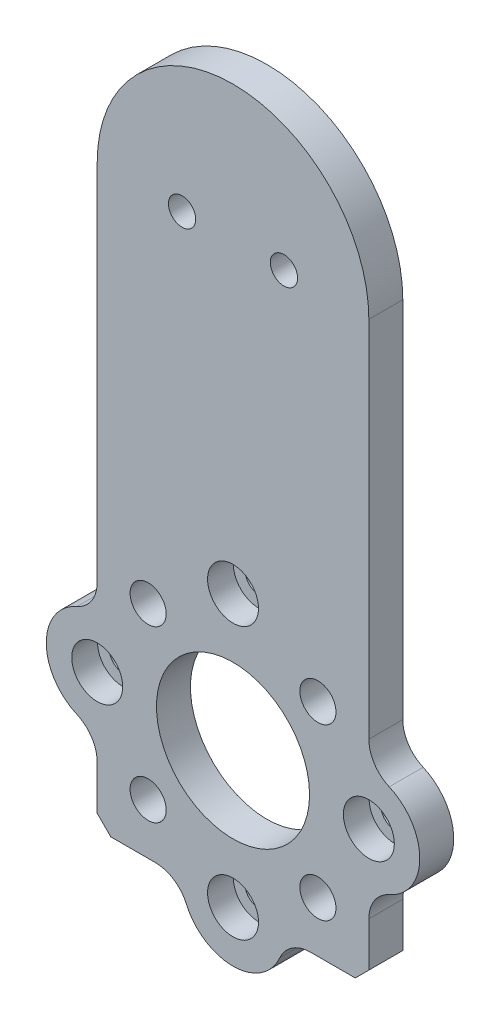
ISO-10303-21;
HEADER;
FILE_DESCRIPTION(('STEP AP214'),'2;1');
FILE_NAME('part.step','',(''),(''),'','','');
FILE_SCHEMA(('AUTOMOTIVE_DESIGN { 1 0 10303 214 1 1 1 1 }'));
ENDSEC;
DATA;
#1=APPLICATION_CONTEXT('core data for automotive mechanical design processes');
#2=APPLICATION_PROTOCOL_DEFINITION('international standard','automotive_design',2000,#1);
#3=PRODUCT_CONTEXT('',#1,'mechanical');
#4=PRODUCT('Part','Part','',(#3));
#5=PRODUCT_RELATED_PRODUCT_CATEGORY('part','',(#4));
#6=PRODUCT_DEFINITION_FORMATION('','',#4);
#7=PRODUCT_DEFINITION_CONTEXT('part definition',#1,'design');
#8=PRODUCT_DEFINITION('design','',#6,#7);
#9=PRODUCT_DEFINITION_SHAPE('','',#8);
#10=(LENGTH_UNIT() NAMED_UNIT(*) SI_UNIT(.MILLI.,.METRE.));
#11=(NAMED_UNIT(*) PLANE_ANGLE_UNIT() SI_UNIT($,.RADIAN.));
#12=(NAMED_UNIT(*) SI_UNIT($,.STERADIAN.) SOLID_ANGLE_UNIT());
#13=UNCERTAINTY_MEASURE_WITH_UNIT(LENGTH_MEASURE(1.E-05),#10,'distance_accuracy_value','');
#14=(GEOMETRIC_REPRESENTATION_CONTEXT(3) GLOBAL_UNCERTAINTY_ASSIGNED_CONTEXT((#13)) GLOBAL_UNIT_ASSIGNED_CONTEXT((#10,
#11,#12)) REPRESENTATION_CONTEXT('',''));
#15=CARTESIAN_POINT('',(0.,0.,0.));
#16=DIRECTION('',(0.,0.,1.));
#17=DIRECTION('',(1.,0.,0.));
#18=AXIS2_PLACEMENT_3D('',#15,#16,#17);
#19=CARTESIAN_POINT('',(0.,25.4,6.35));
#20=DIRECTION('',(0.,0.,-1.));
#21=DIRECTION('',(-1.,0.,0.));
#22=AXIS2_PLACEMENT_3D('',#19,#20,#21);
#23=PLANE('',#22);
#24=CARTESIAN_POINT('',(15.8749999999999,107.95,6.35));
#25=DIRECTION('',(0.,0.,-1.));
#26=DIRECTION('',(-1.,0.,0.));
#27=AXIS2_PLACEMENT_3D('',#24,#25,#26);
#28=CIRCLE('',#27,2.5527);
#29=CARTESIAN_POINT('',(13.3222999999999,107.95,6.35));
#30=VERTEX_POINT('',#29);
#31=EDGE_CURVE('E459',#30,#30,#28,.T.);
#32=ORIENTED_EDGE('',*,*,#31,.T.);
#33=EDGE_LOOP('',(#32));
#34=FACE_BOUND('',#33,.T.);
#35=CARTESIAN_POINT('',(34.9249999999999,107.95,6.35));
#36=DIRECTION('',(0.,0.,-1.));
#37=DIRECTION('',(-1.,0.,0.));
#38=AXIS2_PLACEMENT_3D('',#35,#36,#37);
#39=CIRCLE('',#38,2.5527);
#40=CARTESIAN_POINT('',(32.3722999999999,107.95,6.35));
#41=VERTEX_POINT('',#40);
#42=EDGE_CURVE('E451',#41,#41,#39,.T.);
#43=ORIENTED_EDGE('',*,*,#42,.T.);
#44=EDGE_LOOP('',(#43));
#45=FACE_BOUND('',#44,.T.);
#46=CARTESIAN_POINT('',(0.,25.4,6.35));
#47=DIRECTION('',(0.,0.,1.));
#48=DIRECTION('',(1.,0.,0.));
#49=AXIS2_PLACEMENT_3D('',#46,#47,#48);
#50=CIRCLE('',#49,4.7625);
#51=CARTESIAN_POINT('',(4.7625,25.4,6.35));
#52=VERTEX_POINT('',#51);
#53=EDGE_CURVE('E448',#52,#52,#50,.T.);
#54=ORIENTED_EDGE('',*,*,#53,.F.);
#55=EDGE_LOOP('',(#54));
#56=FACE_BOUND('',#55,.T.);
#57=CARTESIAN_POINT('',(50.8,25.4,6.35));
#58=DIRECTION('',(0.,0.,1.));
#59=DIRECTION('',(1.,0.,0.));
#60=AXIS2_PLACEMENT_3D('',#57,#58,#59);
#61=CIRCLE('',#60,4.7625);
#62=CARTESIAN_POINT('',(55.5625,25.4,6.35));
#63=VERTEX_POINT('',#62);
#64=EDGE_CURVE('E436',#63,#63,#61,.T.);
#65=ORIENTED_EDGE('',*,*,#64,.F.);
#66=EDGE_LOOP('',(#65));
#67=FACE_BOUND('',#66,.T.);
#68=CARTESIAN_POINT('',(25.4,0.,6.35));
#69=DIRECTION('',(0.,0.,1.));
#70=DIRECTION('',(1.,0.,0.));
#71=AXIS2_PLACEMENT_3D('',#68,#69,#70);
#72=CIRCLE('',#71,4.7625);
#73=CARTESIAN_POINT('',(30.1625,0.,6.35));
#74=VERTEX_POINT('',#73);
#75=EDGE_CURVE('E423',#74,#74,#72,.T.);
#76=ORIENTED_EDGE('',*,*,#75,.F.);
#77=EDGE_LOOP('',(#76));
#78=FACE_BOUND('',#77,.T.);
#79=CARTESIAN_POINT('',(25.4,50.8,6.35));
#80=DIRECTION('',(0.,0.,1.));
#81=DIRECTION('',(1.,0.,0.));
#82=AXIS2_PLACEMENT_3D('',#79,#80,#81);
#83=CIRCLE('',#82,4.7625);
#84=CARTESIAN_POINT('',(30.1625,50.8,6.35));
#85=VERTEX_POINT('',#84);
#86=EDGE_CURVE('E410',#85,#85,#83,.T.);
#87=ORIENTED_EDGE('',*,*,#86,.F.);
#88=EDGE_LOOP('',(#87));
#89=FACE_BOUND('',#88,.T.);
#90=DIRECTION('',(0.,-1.,0.));
#91=VECTOR('',#90,1.);
#92=CARTESIAN_POINT('',(0.,0.,6.35));
#93=LINE('',#92,#91);
#94=CARTESIAN_POINT('',(0.,10.8503221685152,6.35));
#95=VERTEX_POINT('',#94);
#96=CARTESIAN_POINT('',(0.,2.54000000000004,6.35));
#97=VERTEX_POINT('',#96);
#98=EDGE_CURVE('E254',#95,#97,#93,.T.);
#99=ORIENTED_EDGE('',*,*,#98,.T.);
#100=DIRECTION('',(-0.707106781186546,0.707106781186549,0.));
#101=VECTOR('',#100,1.);
#102=CARTESIAN_POINT('',(2.54000000000003,0.,6.35));
#103=LINE('',#102,#101);
#104=CARTESIAN_POINT('',(2.54000000000003,0.,6.35));
#105=VERTEX_POINT('',#104);
#106=EDGE_CURVE('E328',#97,#105,#103,.F.);
#107=ORIENTED_EDGE('',*,*,#106,.T.);
#108=DIRECTION('',(1.,0.,0.));
#109=VECTOR('',#108,1.);
#110=CARTESIAN_POINT('',(0.,0.,6.35));
#111=LINE('',#110,#109);
#112=CARTESIAN_POINT('',(10.8503221685152,0.,6.35));
#113=VERTEX_POINT('',#112);
#114=EDGE_CURVE('E360',#105,#113,#111,.T.);
#115=ORIENTED_EDGE('',*,*,#114,.T.);
#116=CARTESIAN_POINT('',(10.8503221685152,-6.35,6.35));
#117=DIRECTION('',(0.,0.,-1.));
#118=DIRECTION('',(-1.,0.,0.));
#119=AXIS2_PLACEMENT_3D('',#116,#117,#118);
#120=CIRCLE('',#119,6.35);
#121=CARTESIAN_POINT('',(16.6701933011091,-3.81,6.35));
#122=VERTEX_POINT('',#121);
#123=EDGE_CURVE('E311',#113,#122,#120,.T.);
#124=ORIENTED_EDGE('',*,*,#123,.T.);
#125=CARTESIAN_POINT('',(25.4,0.,6.35));
#126=DIRECTION('',(0.,0.,1.));
#127=DIRECTION('',(-1.,0.,0.));
#128=AXIS2_PLACEMENT_3D('',#125,#126,#127);
#129=CIRCLE('',#128,9.52500000000001);
#130=CARTESIAN_POINT('',(34.1298066988909,-3.81,6.35));
#131=VERTEX_POINT('',#130);
#132=EDGE_CURVE('E357',#122,#131,#129,.T.);
#133=ORIENTED_EDGE('',*,*,#132,.T.);
#134=CARTESIAN_POINT('',(39.9496778314848,-6.35,6.35));
#135=DIRECTION('',(0.,0.,-1.));
#136=DIRECTION('',(-1.,0.,0.));
#137=AXIS2_PLACEMENT_3D('',#134,#135,#136);
#138=CIRCLE('',#137,6.35);
#139=CARTESIAN_POINT('',(39.9496778314848,0.,6.35));
#140=VERTEX_POINT('',#139);
#141=EDGE_CURVE('E306',#131,#140,#138,.T.);
#142=ORIENTED_EDGE('',*,*,#141,.T.);
#143=DIRECTION('',(1.,0.,0.));
#144=VECTOR('',#143,1.);
#145=CARTESIAN_POINT('',(34.925,0.,6.35));
#146=LINE('',#145,#144);
#147=CARTESIAN_POINT('',(48.26,0.,6.35));
#148=VERTEX_POINT('',#147);
#149=EDGE_CURVE('E353',#140,#148,#146,.T.);
#150=ORIENTED_EDGE('',*,*,#149,.T.);
#151=DIRECTION('',(-0.70710678118655,-0.707106781186546,0.));
#152=VECTOR('',#151,1.);
#153=CARTESIAN_POINT('',(50.8,2.54,6.35));
#154=LINE('',#153,#152);
#155=CARTESIAN_POINT('',(50.8,2.54,6.35));
#156=VERTEX_POINT('',#155);
#157=EDGE_CURVE('E65',#148,#156,#154,.F.);
#158=ORIENTED_EDGE('',*,*,#157,.T.);
#159=DIRECTION('',(0.,1.,0.));
#160=VECTOR('',#159,1.);
#161=CARTESIAN_POINT('',(50.8,15.875,6.35));
#162=LINE('',#161,#160);
#163=CARTESIAN_POINT('',(50.8,10.8503221685152,6.35));
#164=VERTEX_POINT('',#163);
#165=EDGE_CURVE('E334',#156,#164,#162,.T.);
#166=ORIENTED_EDGE('',*,*,#165,.T.);
#167=CARTESIAN_POINT('',(57.15,10.8503221685152,6.35));
#168=DIRECTION('',(0.,0.,-1.));
#169=DIRECTION('',(-1.,0.,0.));
#170=AXIS2_PLACEMENT_3D('',#167,#168,#169);
#171=CIRCLE('',#170,6.35);
#172=CARTESIAN_POINT('',(54.61,16.6701933011091,6.35));
#173=VERTEX_POINT('',#172);
#174=EDGE_CURVE('E302',#164,#173,#171,.T.);
#175=ORIENTED_EDGE('',*,*,#174,.T.);
#176=CARTESIAN_POINT('',(50.8,25.4,6.35));
#177=DIRECTION('',(0.,0.,1.));
#178=DIRECTION('',(1.,0.,0.));
#179=AXIS2_PLACEMENT_3D('',#176,#177,#178);
#180=CIRCLE('',#179,9.525);
#181=CARTESIAN_POINT('',(54.61,34.1298066988909,6.35));
#182=VERTEX_POINT('',#181);
#183=EDGE_CURVE('E197',#173,#182,#180,.T.);
#184=ORIENTED_EDGE('',*,*,#183,.T.);
#185=CARTESIAN_POINT('',(57.15,39.9496778314848,6.35));
#186=DIRECTION('',(0.,0.,-1.));
#187=DIRECTION('',(-1.,0.,0.));
#188=AXIS2_PLACEMENT_3D('',#185,#186,#187);
#189=CIRCLE('',#188,6.35);
#190=CARTESIAN_POINT('',(50.8,39.9496778314848,6.35));
#191=VERTEX_POINT('',#190);
#192=EDGE_CURVE('E192',#182,#191,#189,.T.);
#193=ORIENTED_EDGE('',*,*,#192,.T.);
#194=DIRECTION('',(0.,1.,0.));
#195=VECTOR('',#194,1.);
#196=CARTESIAN_POINT('',(50.8,107.95,6.35));
#197=LINE('',#196,#195);
#198=CARTESIAN_POINT('',(50.8,107.95,6.35));
#199=VERTEX_POINT('',#198);
#200=EDGE_CURVE('E182',#191,#199,#197,.T.);
#201=ORIENTED_EDGE('',*,*,#200,.T.);
#202=CARTESIAN_POINT('',(25.3999999999999,107.95,6.35));
#203=DIRECTION('',(0.,0.,1.));
#204=DIRECTION('',(1.,0.,0.));
#205=AXIS2_PLACEMENT_3D('',#202,#203,#204);
#206=CIRCLE('',#205,25.4);
#207=CARTESIAN_POINT('',(0.,107.95,6.35));
#208=VERTEX_POINT('',#207);
#209=EDGE_CURVE('E188',#199,#208,#206,.T.);
#210=ORIENTED_EDGE('',*,*,#209,.T.);
#211=DIRECTION('',(0.,-1.,0.));
#212=VECTOR('',#211,1.);
#213=CARTESIAN_POINT('',(0.,34.925,6.35));
#214=LINE('',#213,#212);
#215=CARTESIAN_POINT('',(0.,39.9496778314848,6.35));
#216=VERTEX_POINT('',#215);
#217=EDGE_CURVE('E214',#208,#216,#214,.T.);
#218=ORIENTED_EDGE('',*,*,#217,.T.);
#219=CARTESIAN_POINT('',(-6.35,39.9496778314848,6.35));
#220=DIRECTION('',(0.,0.,-1.));
#221=DIRECTION('',(-1.,0.,0.));
#222=AXIS2_PLACEMENT_3D('',#219,#220,#221);
#223=CIRCLE('',#222,6.35);
#224=CARTESIAN_POINT('',(-3.81,34.1298066988909,6.35));
#225=VERTEX_POINT('',#224);
#226=EDGE_CURVE('E297',#216,#225,#223,.T.);
#227=ORIENTED_EDGE('',*,*,#226,.T.);
#228=CARTESIAN_POINT('',(0.,25.4,6.35));
#229=DIRECTION('',(0.,0.,1.));
#230=DIRECTION('',(-1.,0.,0.));
#231=AXIS2_PLACEMENT_3D('',#228,#229,#230);
#232=CIRCLE('',#231,9.525);
#233=CARTESIAN_POINT('',(-3.81,16.6701933011091,6.35));
#234=VERTEX_POINT('',#233);
#235=EDGE_CURVE('E219',#225,#234,#232,.T.);
#236=ORIENTED_EDGE('',*,*,#235,.T.);
#237=CARTESIAN_POINT('',(-6.35,10.8503221685152,6.35));
#238=DIRECTION('',(0.,0.,-1.));
#239=DIRECTION('',(-1.,0.,0.));
#240=AXIS2_PLACEMENT_3D('',#237,#238,#239);
#241=CIRCLE('',#240,6.35);
#242=EDGE_CURVE('E292',#234,#95,#241,.T.);
#243=ORIENTED_EDGE('',*,*,#242,.T.);
#244=EDGE_LOOP('',(#99,#107,#115,#124,#133,#142,#150,#158,#166,#175,#184,#193,#201,#210,#218,
#227,#236,#243));
#245=FACE_BOUND('',#244,.T.);
#246=CARTESIAN_POINT('',(41.275,9.525,6.35));
#247=DIRECTION('',(0.,0.,1.));
#248=DIRECTION('',(1.,0.,0.));
#249=AXIS2_PLACEMENT_3D('',#246,#247,#248);
#250=CIRCLE('',#249,3.3782);
#251=CARTESIAN_POINT('',(44.6532,9.525,6.35));
#252=VERTEX_POINT('',#251);
#253=EDGE_CURVE('E229',#252,#252,#250,.T.);
#254=ORIENTED_EDGE('',*,*,#253,.F.);
#255=EDGE_LOOP('',(#254));
#256=FACE_BOUND('',#255,.T.);
#257=CARTESIAN_POINT('',(9.52499999999999,9.525,6.35));
#258=DIRECTION('',(0.,0.,1.));
#259=DIRECTION('',(1.,0.,0.));
#260=AXIS2_PLACEMENT_3D('',#257,#258,#259);
#261=CIRCLE('',#260,3.3782);
#262=CARTESIAN_POINT('',(12.9032,9.525,6.35));
#263=VERTEX_POINT('',#262);
#264=EDGE_CURVE('E366',#263,#263,#261,.T.);
#265=ORIENTED_EDGE('',*,*,#264,.F.);
#266=EDGE_LOOP('',(#265));
#267=FACE_BOUND('',#266,.T.);
#268=CARTESIAN_POINT('',(9.52499999999999,41.275,6.35));
#269=DIRECTION('',(0.,0.,1.));
#270=DIRECTION('',(1.,0.,0.));
#271=AXIS2_PLACEMENT_3D('',#268,#269,#270);
#272=CIRCLE('',#271,3.3782);
#273=CARTESIAN_POINT('',(12.9032,41.275,6.35));
#274=VERTEX_POINT('',#273);
#275=EDGE_CURVE('E372',#274,#274,#272,.T.);
#276=ORIENTED_EDGE('',*,*,#275,.F.);
#277=EDGE_LOOP('',(#276));
#278=FACE_BOUND('',#277,.T.);
#279=CARTESIAN_POINT('',(41.275,41.275,6.35));
#280=DIRECTION('',(0.,0.,1.));
#281=DIRECTION('',(1.,0.,0.));
#282=AXIS2_PLACEMENT_3D('',#279,#280,#281);
#283=CIRCLE('',#282,3.3782);
#284=CARTESIAN_POINT('',(44.6532,41.275,6.35));
#285=VERTEX_POINT('',#284);
#286=EDGE_CURVE('E379',#285,#285,#283,.T.);
#287=ORIENTED_EDGE('',*,*,#286,.F.);
#288=EDGE_LOOP('',(#287));
#289=FACE_BOUND('',#288,.T.);
#290=CARTESIAN_POINT('',(25.4,25.4,6.35));
#291=DIRECTION('',(0.,0.,1.));
#292=DIRECTION('',(1.,0.,0.));
#293=AXIS2_PLACEMENT_3D('',#290,#291,#292);
#294=CIRCLE('',#293,14.3129);
#295=CARTESIAN_POINT('',(39.7129,25.4,6.35));
#296=VERTEX_POINT('',#295);
#297=EDGE_CURVE('E387',#296,#296,#294,.T.);
#298=ORIENTED_EDGE('',*,*,#297,.F.);
#299=EDGE_LOOP('',(#298));
#300=FACE_BOUND('',#299,.T.);
#301=ADVANCED_FACE('F49',(#34,#45,#56,#67,#78,#89,#245,#256,#267,#278,#289,#300),#23,.F.);
#302=CARTESIAN_POINT('',(0.,25.4,0.));
#303=DIRECTION('',(0.,0.,-1.));
#304=DIRECTION('',(-1.,0.,0.));
#305=AXIS2_PLACEMENT_3D('',#302,#303,#304);
#306=PLANE('',#305);
#307=CARTESIAN_POINT('',(15.8749999999999,107.95,0.));
#308=DIRECTION('',(0.,0.,-1.));
#309=DIRECTION('',(-1.,0.,0.));
#310=AXIS2_PLACEMENT_3D('',#307,#308,#309);
#311=CIRCLE('',#310,2.55269999999999);
#312=CARTESIAN_POINT('',(13.3222999999999,107.95,0.));
#313=VERTEX_POINT('',#312);
#314=EDGE_CURVE('E462',#313,#313,#311,.T.);
#315=ORIENTED_EDGE('',*,*,#314,.F.);
#316=EDGE_LOOP('',(#315));
#317=FACE_BOUND('',#316,.T.);
#318=CARTESIAN_POINT('',(34.9249999999999,107.95,0.));
#319=DIRECTION('',(0.,0.,-1.));
#320=DIRECTION('',(-1.,0.,0.));
#321=AXIS2_PLACEMENT_3D('',#318,#319,#320);
#322=CIRCLE('',#321,2.55269999999999);
#323=CARTESIAN_POINT('',(32.3722999999999,107.95,0.));
#324=VERTEX_POINT('',#323);
#325=EDGE_CURVE('E455',#324,#324,#322,.T.);
#326=ORIENTED_EDGE('',*,*,#325,.F.);
#327=EDGE_LOOP('',(#326));
#328=FACE_BOUND('',#327,.T.);
#329=CARTESIAN_POINT('',(0.,25.4,0.));
#330=DIRECTION('',(0.,0.,1.));
#331=DIRECTION('',(1.,0.,0.));
#332=AXIS2_PLACEMENT_3D('',#329,#330,#331);
#333=CIRCLE('',#332,2.5527);
#334=CARTESIAN_POINT('',(2.5527,25.4,0.));
#335=VERTEX_POINT('',#334);
#336=EDGE_CURVE('E439',#335,#335,#333,.T.);
#337=ORIENTED_EDGE('',*,*,#336,.T.);
#338=EDGE_LOOP('',(#337));
#339=FACE_BOUND('',#338,.T.);
#340=CARTESIAN_POINT('',(50.8,25.4,0.));
#341=DIRECTION('',(0.,0.,1.));
#342=DIRECTION('',(1.,0.,0.));
#343=AXIS2_PLACEMENT_3D('',#340,#341,#342);
#344=CIRCLE('',#343,2.5527);
#345=CARTESIAN_POINT('',(53.3527,25.4,0.));
#346=VERTEX_POINT('',#345);
#347=EDGE_CURVE('E426',#346,#346,#344,.T.);
#348=ORIENTED_EDGE('',*,*,#347,.T.);
#349=EDGE_LOOP('',(#348));
#350=FACE_BOUND('',#349,.T.);
#351=CARTESIAN_POINT('',(25.4,0.,0.));
#352=DIRECTION('',(0.,0.,1.));
#353=DIRECTION('',(1.,0.,0.));
#354=AXIS2_PLACEMENT_3D('',#351,#352,#353);
#355=CIRCLE('',#354,2.5527);
#356=CARTESIAN_POINT('',(27.9527,0.,0.));
#357=VERTEX_POINT('',#356);
#358=EDGE_CURVE('E414',#357,#357,#355,.T.);
#359=ORIENTED_EDGE('',*,*,#358,.T.);
#360=EDGE_LOOP('',(#359));
#361=FACE_BOUND('',#360,.T.);
#362=CARTESIAN_POINT('',(25.4,50.8,0.));
#363=DIRECTION('',(0.,0.,1.));
#364=DIRECTION('',(1.,0.,0.));
#365=AXIS2_PLACEMENT_3D('',#362,#363,#364);
#366=CIRCLE('',#365,2.5527);
#367=CARTESIAN_POINT('',(27.9527,50.8,0.));
#368=VERTEX_POINT('',#367);
#369=EDGE_CURVE('E395',#368,#368,#366,.T.);
#370=ORIENTED_EDGE('',*,*,#369,.T.);
#371=EDGE_LOOP('',(#370));
#372=FACE_BOUND('',#371,.T.);
#373=CARTESIAN_POINT('',(41.275,41.275,0.));
#374=DIRECTION('',(0.,0.,1.));
#375=DIRECTION('',(1.,0.,0.));
#376=AXIS2_PLACEMENT_3D('',#373,#374,#375);
#377=CIRCLE('',#376,3.3782);
#378=CARTESIAN_POINT('',(44.6532,41.275,0.));
#379=VERTEX_POINT('',#378);
#380=EDGE_CURVE('E383',#379,#379,#377,.T.);
#381=ORIENTED_EDGE('',*,*,#380,.T.);
#382=EDGE_LOOP('',(#381));
#383=FACE_BOUND('',#382,.T.);
#384=CARTESIAN_POINT('',(9.52499999999999,9.525,0.));
#385=DIRECTION('',(0.,0.,1.));
#386=DIRECTION('',(1.,0.,0.));
#387=AXIS2_PLACEMENT_3D('',#384,#385,#386);
#388=CIRCLE('',#387,3.3782);
#389=CARTESIAN_POINT('',(12.9032,9.525,0.));
#390=VERTEX_POINT('',#389);
#391=EDGE_CURVE('E369',#390,#390,#388,.T.);
#392=ORIENTED_EDGE('',*,*,#391,.T.);
#393=EDGE_LOOP('',(#392));
#394=FACE_BOUND('',#393,.T.);
#395=DIRECTION('',(1.,0.,0.));
#396=VECTOR('',#395,1.);
#397=CARTESIAN_POINT('',(0.,0.,0.));
#398=LINE('',#397,#396);
#399=CARTESIAN_POINT('',(2.54000000000003,0.,0.));
#400=VERTEX_POINT('',#399);
#401=CARTESIAN_POINT('',(10.8503221685152,0.,0.));
#402=VERTEX_POINT('',#401);
#403=EDGE_CURVE('E228',#400,#402,#398,.T.);
#404=ORIENTED_EDGE('',*,*,#403,.F.);
#405=DIRECTION('',(0.707106781186546,-0.707106781186549,0.));
#406=VECTOR('',#405,1.);
#407=CARTESIAN_POINT('',(-11.43,13.9700000000001,0.));
#408=LINE('',#407,#406);
#409=CARTESIAN_POINT('',(0.,2.54000000000004,0.));
#410=VERTEX_POINT('',#409);
#411=EDGE_CURVE('E323',#400,#410,#408,.F.);
#412=ORIENTED_EDGE('',*,*,#411,.T.);
#413=DIRECTION('',(0.,-1.,0.));
#414=VECTOR('',#413,1.);
#415=CARTESIAN_POINT('',(0.,0.,0.));
#416=LINE('',#415,#414);
#417=CARTESIAN_POINT('',(0.,10.8503221685152,0.));
#418=VERTEX_POINT('',#417);
#419=EDGE_CURVE('E225',#418,#410,#416,.T.);
#420=ORIENTED_EDGE('',*,*,#419,.F.);
#421=CARTESIAN_POINT('',(-6.35,10.8503221685152,0.));
#422=DIRECTION('',(0.,0.,-1.));
#423=DIRECTION('',(-1.,0.,0.));
#424=AXIS2_PLACEMENT_3D('',#421,#422,#423);
#425=CIRCLE('',#424,6.35);
#426=CARTESIAN_POINT('',(-3.81,16.6701933011091,0.));
#427=VERTEX_POINT('',#426);
#428=EDGE_CURVE('E290',#418,#427,#425,.F.);
#429=ORIENTED_EDGE('',*,*,#428,.T.);
#430=CARTESIAN_POINT('',(0.,25.4,0.));
#431=DIRECTION('',(0.,0.,1.));
#432=DIRECTION('',(-1.,0.,0.));
#433=AXIS2_PLACEMENT_3D('',#430,#431,#432);
#434=CIRCLE('',#433,9.525);
#435=CARTESIAN_POINT('',(-3.81,34.1298066988909,0.));
#436=VERTEX_POINT('',#435);
#437=EDGE_CURVE('E251',#436,#427,#434,.T.);
#438=ORIENTED_EDGE('',*,*,#437,.F.);
#439=CARTESIAN_POINT('',(-6.35,39.9496778314848,0.));
#440=DIRECTION('',(0.,0.,-1.));
#441=DIRECTION('',(-1.,0.,0.));
#442=AXIS2_PLACEMENT_3D('',#439,#440,#441);
#443=CIRCLE('',#442,6.35);
#444=CARTESIAN_POINT('',(0.,39.9496778314848,0.));
#445=VERTEX_POINT('',#444);
#446=EDGE_CURVE('E294',#436,#445,#443,.F.);
#447=ORIENTED_EDGE('',*,*,#446,.T.);
#448=DIRECTION('',(0.,-1.,0.));
#449=VECTOR('',#448,1.);
#450=CARTESIAN_POINT('',(0.,34.925,0.));
#451=LINE('',#450,#449);
#452=CARTESIAN_POINT('',(0.,107.95,0.));
#453=VERTEX_POINT('',#452);
#454=EDGE_CURVE('E247',#453,#445,#451,.T.);
#455=ORIENTED_EDGE('',*,*,#454,.F.);
#456=CARTESIAN_POINT('',(25.3999999999999,107.95,0.));
#457=DIRECTION('',(0.,0.,1.));
#458=DIRECTION('',(1.,0.,0.));
#459=AXIS2_PLACEMENT_3D('',#456,#457,#458);
#460=CIRCLE('',#459,25.4);
#461=CARTESIAN_POINT('',(50.8,107.95,0.));
#462=VERTEX_POINT('',#461);
#463=EDGE_CURVE('E244',#462,#453,#460,.T.);
#464=ORIENTED_EDGE('',*,*,#463,.F.);
#465=DIRECTION('',(0.,1.,0.));
#466=VECTOR('',#465,1.);
#467=CARTESIAN_POINT('',(50.8,107.95,0.));
#468=LINE('',#467,#466);
#469=CARTESIAN_POINT('',(50.8,39.9496778314848,0.));
#470=VERTEX_POINT('',#469);
#471=EDGE_CURVE('E203',#470,#462,#468,.T.);
#472=ORIENTED_EDGE('',*,*,#471,.F.);
#473=CARTESIAN_POINT('',(57.15,39.9496778314848,0.));
#474=DIRECTION('',(0.,0.,-1.));
#475=DIRECTION('',(-1.,0.,0.));
#476=AXIS2_PLACEMENT_3D('',#473,#474,#475);
#477=CIRCLE('',#476,6.35);
#478=CARTESIAN_POINT('',(54.61,34.1298066988909,0.));
#479=VERTEX_POINT('',#478);
#480=EDGE_CURVE('E313',#470,#479,#477,.F.);
#481=ORIENTED_EDGE('',*,*,#480,.T.);
#482=CARTESIAN_POINT('',(50.8,25.4,0.));
#483=DIRECTION('',(0.,0.,1.));
#484=DIRECTION('',(1.,0.,0.));
#485=AXIS2_PLACEMENT_3D('',#482,#483,#484);
#486=CIRCLE('',#485,9.525);
#487=CARTESIAN_POINT('',(54.61,16.6701933011091,0.));
#488=VERTEX_POINT('',#487);
#489=EDGE_CURVE('E238',#488,#479,#486,.T.);
#490=ORIENTED_EDGE('',*,*,#489,.F.);
#491=CARTESIAN_POINT('',(57.15,10.8503221685152,0.));
#492=DIRECTION('',(0.,0.,-1.));
#493=DIRECTION('',(-1.,0.,0.));
#494=AXIS2_PLACEMENT_3D('',#491,#492,#493);
#495=CIRCLE('',#494,6.35);
#496=CARTESIAN_POINT('',(50.8,10.8503221685152,0.));
#497=VERTEX_POINT('',#496);
#498=EDGE_CURVE('E299',#488,#497,#495,.F.);
#499=ORIENTED_EDGE('',*,*,#498,.T.);
#500=DIRECTION('',(0.,1.,0.));
#501=VECTOR('',#500,1.);
#502=CARTESIAN_POINT('',(50.8,15.875,0.));
#503=LINE('',#502,#501);
#504=CARTESIAN_POINT('',(50.8,2.54,0.));
#505=VERTEX_POINT('',#504);
#506=EDGE_CURVE('E236',#505,#497,#503,.T.);
#507=ORIENTED_EDGE('',*,*,#506,.F.);
#508=DIRECTION('',(0.70710678118655,0.707106781186546,0.));
#509=VECTOR('',#508,1.);
#510=CARTESIAN_POINT('',(36.8299999999999,-11.4300000000001,0.));
#511=LINE('',#510,#509);
#512=CARTESIAN_POINT('',(48.26,0.,0.));
#513=VERTEX_POINT('',#512);
#514=EDGE_CURVE('E321',#505,#513,#511,.F.);
#515=ORIENTED_EDGE('',*,*,#514,.T.);
#516=DIRECTION('',(1.,0.,0.));
#517=VECTOR('',#516,1.);
#518=CARTESIAN_POINT('',(34.925,0.,0.));
#519=LINE('',#518,#517);
#520=CARTESIAN_POINT('',(39.9496778314848,0.,0.));
#521=VERTEX_POINT('',#520);
#522=EDGE_CURVE('E234',#521,#513,#519,.T.);
#523=ORIENTED_EDGE('',*,*,#522,.F.);
#524=CARTESIAN_POINT('',(39.9496778314848,-6.35,0.));
#525=DIRECTION('',(0.,0.,-1.));
#526=DIRECTION('',(-1.,0.,0.));
#527=AXIS2_PLACEMENT_3D('',#524,#525,#526);
#528=CIRCLE('',#527,6.35);
#529=CARTESIAN_POINT('',(34.1298066988909,-3.81,0.));
#530=VERTEX_POINT('',#529);
#531=EDGE_CURVE('E304',#521,#530,#528,.F.);
#532=ORIENTED_EDGE('',*,*,#531,.T.);
#533=CARTESIAN_POINT('',(25.4,0.,0.));
#534=DIRECTION('',(0.,0.,1.));
#535=DIRECTION('',(-1.,0.,0.));
#536=AXIS2_PLACEMENT_3D('',#533,#534,#535);
#537=CIRCLE('',#536,9.52500000000001);
#538=CARTESIAN_POINT('',(16.6701933011091,-3.81,0.));
#539=VERTEX_POINT('',#538);
#540=EDGE_CURVE('E231',#539,#530,#537,.T.);
#541=ORIENTED_EDGE('',*,*,#540,.F.);
#542=CARTESIAN_POINT('',(10.8503221685152,-6.35,0.));
#543=DIRECTION('',(0.,0.,-1.));
#544=DIRECTION('',(-1.,0.,0.));
#545=AXIS2_PLACEMENT_3D('',#542,#543,#544);
#546=CIRCLE('',#545,6.35);
#547=EDGE_CURVE('E308',#539,#402,#546,.F.);
#548=ORIENTED_EDGE('',*,*,#547,.T.);
#549=EDGE_LOOP('',(#404,#412,#420,#429,#438,#447,#455,#464,#472,#481,#490,#499,#507,#515,#523,
#532,#541,#548));
#550=FACE_BOUND('',#549,.T.);
#551=CARTESIAN_POINT('',(41.275,9.525,0.));
#552=DIRECTION('',(0.,0.,1.));
#553=DIRECTION('',(1.,0.,0.));
#554=AXIS2_PLACEMENT_3D('',#551,#552,#553);
#555=CIRCLE('',#554,3.3782);
#556=CARTESIAN_POINT('',(44.6532,9.525,0.));
#557=VERTEX_POINT('',#556);
#558=EDGE_CURVE('E363',#557,#557,#555,.T.);
#559=ORIENTED_EDGE('',*,*,#558,.T.);
#560=EDGE_LOOP('',(#559));
#561=FACE_BOUND('',#560,.T.);
#562=CARTESIAN_POINT('',(9.52499999999999,41.275,0.));
#563=DIRECTION('',(0.,0.,1.));
#564=DIRECTION('',(1.,0.,0.));
#565=AXIS2_PLACEMENT_3D('',#562,#563,#564);
#566=CIRCLE('',#565,3.3782);
#567=CARTESIAN_POINT('',(12.9032,41.275,0.));
#568=VERTEX_POINT('',#567);
#569=EDGE_CURVE('E375',#568,#568,#566,.T.);
#570=ORIENTED_EDGE('',*,*,#569,.T.);
#571=EDGE_LOOP('',(#570));
#572=FACE_BOUND('',#571,.T.);
#573=CARTESIAN_POINT('',(25.4,25.4,0.));
#574=DIRECTION('',(0.,0.,1.));
#575=DIRECTION('',(1.,0.,0.));
#576=AXIS2_PLACEMENT_3D('',#573,#574,#575);
#577=CIRCLE('',#576,14.3129);
#578=CARTESIAN_POINT('',(39.7129,25.4,0.));
#579=VERTEX_POINT('',#578);
#580=EDGE_CURVE('E391',#579,#579,#577,.T.);
#581=ORIENTED_EDGE('',*,*,#580,.T.);
#582=EDGE_LOOP('',(#581));
#583=FACE_BOUND('',#582,.T.);
#584=ADVANCED_FACE('F338',(#317,#328,#339,#350,#361,#372,#383,#394,#550,#561,#572,#583),#306,.T.);
#585=CARTESIAN_POINT('',(0.,0.,6.35));
#586=DIRECTION('',(1.,0.,0.));
#587=DIRECTION('',(0.,0.,-1.));
#588=AXIS2_PLACEMENT_3D('',#585,#586,#587);
#589=PLANE('',#588);
#590=ORIENTED_EDGE('',*,*,#419,.T.);
#591=DIRECTION('',(0.,0.,1.));
#592=VECTOR('',#591,1.);
#593=CARTESIAN_POINT('',(0.,2.54000000000004,6.35));
#594=LINE('',#593,#592);
#595=EDGE_CURVE('E325',#410,#97,#594,.T.);
#596=ORIENTED_EDGE('',*,*,#595,.T.);
#597=ORIENTED_EDGE('',*,*,#98,.F.);
#598=DIRECTION('',(0.,0.,1.));
#599=VECTOR('',#598,1.);
#600=CARTESIAN_POINT('',(0.,10.8503221685152,0.));
#601=LINE('',#600,#599);
#602=EDGE_CURVE('E207',#95,#418,#601,.F.);
#603=ORIENTED_EDGE('',*,*,#602,.T.);
#604=EDGE_LOOP('',(#590,#596,#597,#603));
#605=FACE_BOUND('',#604,.T.);
#606=ADVANCED_FACE('F470',(#605),#589,.F.);
#607=CARTESIAN_POINT('',(0.,0.,6.35));
#608=DIRECTION('',(0.,1.,0.));
#609=DIRECTION('',(0.,0.,1.));
#610=AXIS2_PLACEMENT_3D('',#607,#608,#609);
#611=PLANE('',#610);
#612=ORIENTED_EDGE('',*,*,#114,.F.);
#613=DIRECTION('',(0.,0.,-1.));
#614=VECTOR('',#613,1.);
#615=CARTESIAN_POINT('',(2.54000000000003,0.,6.35));
#616=LINE('',#615,#614);
#617=EDGE_CURVE('E318',#105,#400,#616,.T.);
#618=ORIENTED_EDGE('',*,*,#617,.T.);
#619=ORIENTED_EDGE('',*,*,#403,.T.);
#620=DIRECTION('',(0.,0.,1.));
#621=VECTOR('',#620,1.);
#622=CARTESIAN_POINT('',(10.8503221685152,0.,6.35));
#623=LINE('',#622,#621);
#624=EDGE_CURVE('E284',#402,#113,#623,.T.);
#625=ORIENTED_EDGE('',*,*,#624,.T.);
#626=EDGE_LOOP('',(#612,#618,#619,#625));
#627=FACE_BOUND('',#626,.T.);
#628=ADVANCED_FACE('F530',(#627),#611,.F.);
#629=CARTESIAN_POINT('',(25.4,0.,6.35));
#630=DIRECTION('',(0.,0.,-1.));
#631=DIRECTION('',(-1.,0.,0.));
#632=AXIS2_PLACEMENT_3D('',#629,#630,#631);
#633=CYLINDRICAL_SURFACE('',#632,9.52500000000001);
#634=ORIENTED_EDGE('',*,*,#540,.T.);
#635=DIRECTION('',(0.,0.,-1.));
#636=VECTOR('',#635,1.);
#637=CARTESIAN_POINT('',(34.1298066988909,-3.81,6.35));
#638=LINE('',#637,#636);
#639=EDGE_CURVE('E282',#530,#131,#638,.F.);
#640=ORIENTED_EDGE('',*,*,#639,.T.);
#641=ORIENTED_EDGE('',*,*,#132,.F.);
#642=DIRECTION('',(0.,0.,-1.));
#643=VECTOR('',#642,1.);
#644=CARTESIAN_POINT('',(16.6701933011091,-3.81,6.35));
#645=LINE('',#644,#643);
#646=EDGE_CURVE('E279',#122,#539,#645,.T.);
#647=ORIENTED_EDGE('',*,*,#646,.T.);
#648=EDGE_LOOP('',(#634,#640,#641,#647));
#649=FACE_BOUND('',#648,.T.);
#650=ADVANCED_FACE('F527',(#649),#633,.T.);
#651=CARTESIAN_POINT('',(34.925,0.,6.35));
#652=DIRECTION('',(0.,1.,0.));
#653=DIRECTION('',(0.,0.,1.));
#654=AXIS2_PLACEMENT_3D('',#651,#652,#653);
#655=PLANE('',#654);
#656=ORIENTED_EDGE('',*,*,#522,.T.);
#657=DIRECTION('',(0.,0.,1.));
#658=VECTOR('',#657,1.);
#659=CARTESIAN_POINT('',(48.26,0.,6.35));
#660=LINE('',#659,#658);
#661=EDGE_CURVE('E11',#513,#148,#660,.T.);
#662=ORIENTED_EDGE('',*,*,#661,.T.);
#663=ORIENTED_EDGE('',*,*,#149,.F.);
#664=DIRECTION('',(0.,0.,1.));
#665=VECTOR('',#664,1.);
#666=CARTESIAN_POINT('',(39.9496778314848,0.,0.));
#667=LINE('',#666,#665);
#668=EDGE_CURVE('E276',#140,#521,#667,.F.);
#669=ORIENTED_EDGE('',*,*,#668,.T.);
#670=EDGE_LOOP('',(#656,#662,#663,#669));
#671=FACE_BOUND('',#670,.T.);
#672=ADVANCED_FACE('F524',(#671),#655,.F.);
#673=CARTESIAN_POINT('',(50.8,15.875,6.35));
#674=DIRECTION('',(-1.,0.,0.));
#675=DIRECTION('',(0.,-1.,0.));
#676=AXIS2_PLACEMENT_3D('',#673,#674,#675);
#677=PLANE('',#676);
#678=ORIENTED_EDGE('',*,*,#165,.F.);
#679=DIRECTION('',(0.,0.,-1.));
#680=VECTOR('',#679,1.);
#681=CARTESIAN_POINT('',(50.8,2.54,6.35));
#682=LINE('',#681,#680);
#683=EDGE_CURVE('E58',#156,#505,#682,.T.);
#684=ORIENTED_EDGE('',*,*,#683,.T.);
#685=ORIENTED_EDGE('',*,*,#506,.T.);
#686=DIRECTION('',(0.,0.,1.));
#687=VECTOR('',#686,1.);
#688=CARTESIAN_POINT('',(50.8,10.8503221685152,6.35));
#689=LINE('',#688,#687);
#690=EDGE_CURVE('E273',#497,#164,#689,.T.);
#691=ORIENTED_EDGE('',*,*,#690,.T.);
#692=EDGE_LOOP('',(#678,#684,#685,#691));
#693=FACE_BOUND('',#692,.T.);
#694=ADVANCED_FACE('F333',(#693),#677,.F.);
#695=CARTESIAN_POINT('',(50.8,25.4,6.35));
#696=DIRECTION('',(0.,0.,-1.));
#697=DIRECTION('',(-1.,0.,0.));
#698=AXIS2_PLACEMENT_3D('',#695,#696,#697);
#699=CYLINDRICAL_SURFACE('',#698,9.525);
#700=ORIENTED_EDGE('',*,*,#183,.F.);
#701=DIRECTION('',(0.,0.,-1.));
#702=VECTOR('',#701,1.);
#703=CARTESIAN_POINT('',(54.61,16.6701933011091,6.35));
#704=LINE('',#703,#702);
#705=EDGE_CURVE('E270',#173,#488,#704,.T.);
#706=ORIENTED_EDGE('',*,*,#705,.T.);
#707=ORIENTED_EDGE('',*,*,#489,.T.);
#708=DIRECTION('',(0.,0.,-1.));
#709=VECTOR('',#708,1.);
#710=CARTESIAN_POINT('',(54.61,34.1298066988909,6.35));
#711=LINE('',#710,#709);
#712=EDGE_CURVE('E267',#479,#182,#711,.F.);
#713=ORIENTED_EDGE('',*,*,#712,.T.);
#714=EDGE_LOOP('',(#700,#706,#707,#713));
#715=FACE_BOUND('',#714,.T.);
#716=ADVANCED_FACE('F349',(#715),#699,.T.);
#717=CARTESIAN_POINT('',(50.8,107.95,6.35));
#718=DIRECTION('',(-1.,0.,0.));
#719=DIRECTION('',(0.,-1.,0.));
#720=AXIS2_PLACEMENT_3D('',#717,#718,#719);
#721=PLANE('',#720);
#722=ORIENTED_EDGE('',*,*,#200,.F.);
#723=DIRECTION('',(0.,0.,1.));
#724=VECTOR('',#723,1.);
#725=CARTESIAN_POINT('',(50.8,39.9496778314848,0.));
#726=LINE('',#725,#724);
#727=EDGE_CURVE('E287',#191,#470,#726,.F.);
#728=ORIENTED_EDGE('',*,*,#727,.T.);
#729=ORIENTED_EDGE('',*,*,#471,.T.);
#730=DIRECTION('',(0.,0.,-1.));
#731=VECTOR('',#730,1.);
#732=CARTESIAN_POINT('',(50.8,107.95,6.35));
#733=LINE('',#732,#731);
#734=EDGE_CURVE('E200',#199,#462,#733,.T.);
#735=ORIENTED_EDGE('',*,*,#734,.F.);
#736=EDGE_LOOP('',(#722,#728,#729,#735));
#737=FACE_BOUND('',#736,.T.);
#738=ADVANCED_FACE('F201',(#737),#721,.F.);
#739=CARTESIAN_POINT('',(25.3999999999999,107.95,6.35));
#740=DIRECTION('',(0.,0.,-1.));
#741=DIRECTION('',(-1.,0.,0.));
#742=AXIS2_PLACEMENT_3D('',#739,#740,#741);
#743=CYLINDRICAL_SURFACE('',#742,25.4);
#744=ORIENTED_EDGE('',*,*,#463,.T.);
#745=DIRECTION('',(0.,0.,-1.));
#746=VECTOR('',#745,1.);
#747=CARTESIAN_POINT('',(0.,107.95,6.35));
#748=LINE('',#747,#746);
#749=EDGE_CURVE('E208',#208,#453,#748,.T.);
#750=ORIENTED_EDGE('',*,*,#749,.F.);
#751=ORIENTED_EDGE('',*,*,#209,.F.);
#752=ORIENTED_EDGE('',*,*,#734,.T.);
#753=EDGE_LOOP('',(#744,#750,#751,#752));
#754=FACE_BOUND('',#753,.T.);
#755=ADVANCED_FACE('F210',(#754),#743,.T.);
#756=CARTESIAN_POINT('',(0.,34.925,6.35));
#757=DIRECTION('',(1.,0.,0.));
#758=DIRECTION('',(0.,0.,-1.));
#759=AXIS2_PLACEMENT_3D('',#756,#757,#758);
#760=PLANE('',#759);
#761=ORIENTED_EDGE('',*,*,#454,.T.);
#762=DIRECTION('',(0.,0.,1.));
#763=VECTOR('',#762,1.);
#764=CARTESIAN_POINT('',(0.,39.9496778314848,6.35));
#765=LINE('',#764,#763);
#766=EDGE_CURVE('E264',#445,#216,#765,.T.);
#767=ORIENTED_EDGE('',*,*,#766,.T.);
#768=ORIENTED_EDGE('',*,*,#217,.F.);
#769=ORIENTED_EDGE('',*,*,#749,.T.);
#770=EDGE_LOOP('',(#761,#767,#768,#769));
#771=FACE_BOUND('',#770,.T.);
#772=ADVANCED_FACE('F511',(#771),#760,.F.);
#773=CARTESIAN_POINT('',(0.,25.4,6.35));
#774=DIRECTION('',(0.,0.,-1.));
#775=DIRECTION('',(-1.,0.,0.));
#776=AXIS2_PLACEMENT_3D('',#773,#774,#775);
#777=CYLINDRICAL_SURFACE('',#776,9.525);
#778=ORIENTED_EDGE('',*,*,#437,.T.);
#779=DIRECTION('',(0.,0.,-1.));
#780=VECTOR('',#779,1.);
#781=CARTESIAN_POINT('',(-3.81,16.6701933011091,6.35));
#782=LINE('',#781,#780);
#783=EDGE_CURVE('E262',#427,#234,#782,.F.);
#784=ORIENTED_EDGE('',*,*,#783,.T.);
#785=ORIENTED_EDGE('',*,*,#235,.F.);
#786=DIRECTION('',(0.,0.,-1.));
#787=VECTOR('',#786,1.);
#788=CARTESIAN_POINT('',(-3.81,34.1298066988909,6.35));
#789=LINE('',#788,#787);
#790=EDGE_CURVE('E259',#225,#436,#789,.T.);
#791=ORIENTED_EDGE('',*,*,#790,.T.);
#792=EDGE_LOOP('',(#778,#784,#785,#791));
#793=FACE_BOUND('',#792,.T.);
#794=ADVANCED_FACE('F499',(#793),#777,.T.);
#795=CARTESIAN_POINT('',(41.275,9.525,6.35));
#796=DIRECTION('',(0.,0.,-1.));
#797=DIRECTION('',(-1.,0.,0.));
#798=AXIS2_PLACEMENT_3D('',#795,#796,#797);
#799=CYLINDRICAL_SURFACE('',#798,3.3782);
#800=ORIENTED_EDGE('',*,*,#253,.T.);
#801=EDGE_LOOP('',(#800));
#802=FACE_BOUND('',#801,.T.);
#803=ORIENTED_EDGE('',*,*,#558,.F.);
#804=EDGE_LOOP('',(#803));
#805=FACE_BOUND('',#804,.T.);
#806=ADVANCED_FACE('F489',(#802,#805),#799,.F.);
#807=CARTESIAN_POINT('',(9.52499999999999,9.525,6.35));
#808=DIRECTION('',(0.,0.,-1.));
#809=DIRECTION('',(-1.,0.,0.));
#810=AXIS2_PLACEMENT_3D('',#807,#808,#809);
#811=CYLINDRICAL_SURFACE('',#810,3.3782);
#812=ORIENTED_EDGE('',*,*,#264,.T.);
#813=EDGE_LOOP('',(#812));
#814=FACE_BOUND('',#813,.T.);
#815=ORIENTED_EDGE('',*,*,#391,.F.);
#816=EDGE_LOOP('',(#815));
#817=FACE_BOUND('',#816,.T.);
#818=ADVANCED_FACE('F486',(#814,#817),#811,.F.);
#819=CARTESIAN_POINT('',(9.52499999999999,41.275,6.35));
#820=DIRECTION('',(0.,0.,-1.));
#821=DIRECTION('',(-1.,0.,0.));
#822=AXIS2_PLACEMENT_3D('',#819,#820,#821);
#823=CYLINDRICAL_SURFACE('',#822,3.3782);
#824=ORIENTED_EDGE('',*,*,#275,.T.);
#825=EDGE_LOOP('',(#824));
#826=FACE_BOUND('',#825,.T.);
#827=ORIENTED_EDGE('',*,*,#569,.F.);
#828=EDGE_LOOP('',(#827));
#829=FACE_BOUND('',#828,.T.);
#830=ADVANCED_FACE('F488',(#826,#829),#823,.F.);
#831=CARTESIAN_POINT('',(41.275,41.275,6.35));
#832=DIRECTION('',(0.,0.,-1.));
#833=DIRECTION('',(-1.,0.,0.));
#834=AXIS2_PLACEMENT_3D('',#831,#832,#833);
#835=CYLINDRICAL_SURFACE('',#834,3.3782);
#836=ORIENTED_EDGE('',*,*,#286,.T.);
#837=EDGE_LOOP('',(#836));
#838=FACE_BOUND('',#837,.T.);
#839=ORIENTED_EDGE('',*,*,#380,.F.);
#840=EDGE_LOOP('',(#839));
#841=FACE_BOUND('',#840,.T.);
#842=ADVANCED_FACE('F496',(#838,#841),#835,.F.);
#843=CARTESIAN_POINT('',(25.4,25.4,6.35));
#844=DIRECTION('',(0.,0.,-1.));
#845=DIRECTION('',(-1.,0.,0.));
#846=AXIS2_PLACEMENT_3D('',#843,#844,#845);
#847=CYLINDRICAL_SURFACE('',#846,14.3129);
#848=ORIENTED_EDGE('',*,*,#297,.T.);
#849=EDGE_LOOP('',(#848));
#850=FACE_BOUND('',#849,.T.);
#851=ORIENTED_EDGE('',*,*,#580,.F.);
#852=EDGE_LOOP('',(#851));
#853=FACE_BOUND('',#852,.T.);
#854=ADVANCED_FACE('F876',(#850,#853),#847,.F.);
#855=CARTESIAN_POINT('',(25.4,50.8,6.35));
#856=DIRECTION('',(0.,0.,1.));
#857=DIRECTION('',(1.,0.,0.));
#858=AXIS2_PLACEMENT_3D('',#855,#856,#857);
#859=CYLINDRICAL_SURFACE('',#858,2.5527);
#860=ORIENTED_EDGE('',*,*,#369,.F.);
#861=EDGE_LOOP('',(#860));
#862=FACE_BOUND('',#861,.T.);
#863=CARTESIAN_POINT('',(25.4,50.8,1.524));
#864=DIRECTION('',(0.,0.,1.));
#865=DIRECTION('',(1.,0.,0.));
#866=AXIS2_PLACEMENT_3D('',#863,#864,#865);
#867=CIRCLE('',#866,2.5527);
#868=CARTESIAN_POINT('',(27.9527,50.8,1.524));
#869=VERTEX_POINT('',#868);
#870=EDGE_CURVE('E402',#869,#869,#867,.T.);
#871=ORIENTED_EDGE('',*,*,#870,.T.);
#872=EDGE_LOOP('',(#871));
#873=FACE_BOUND('',#872,.T.);
#874=ADVANCED_FACE('F865',(#862,#873),#859,.F.);
#875=CARTESIAN_POINT('',(27.9527,50.8,1.524));
#876=DIRECTION('',(0.,0.,-1.));
#877=DIRECTION('',(-1.,0.,0.));
#878=AXIS2_PLACEMENT_3D('',#875,#876,#877);
#879=PLANE('',#878);
#880=ORIENTED_EDGE('',*,*,#870,.F.);
#881=EDGE_LOOP('',(#880));
#882=FACE_BOUND('',#881,.T.);
#883=CARTESIAN_POINT('',(25.4,50.8,1.524));
#884=DIRECTION('',(0.,0.,1.));
#885=DIRECTION('',(1.,0.,0.));
#886=AXIS2_PLACEMENT_3D('',#883,#884,#885);
#887=CIRCLE('',#886,4.7625);
#888=CARTESIAN_POINT('',(30.1625,50.8,1.524));
#889=VERTEX_POINT('',#888);
#890=EDGE_CURVE('E406',#889,#889,#887,.T.);
#891=ORIENTED_EDGE('',*,*,#890,.T.);
#892=EDGE_LOOP('',(#891));
#893=FACE_BOUND('',#892,.T.);
#894=ADVANCED_FACE('F854',(#882,#893),#879,.F.);
#895=CARTESIAN_POINT('',(25.4,50.8,6.35));
#896=DIRECTION('',(0.,0.,1.));
#897=DIRECTION('',(1.,0.,0.));
#898=AXIS2_PLACEMENT_3D('',#895,#896,#897);
#899=CYLINDRICAL_SURFACE('',#898,4.7625);
#900=ORIENTED_EDGE('',*,*,#890,.F.);
#901=EDGE_LOOP('',(#900));
#902=FACE_BOUND('',#901,.T.);
#903=ORIENTED_EDGE('',*,*,#86,.T.);
#904=EDGE_LOOP('',(#903));
#905=FACE_BOUND('',#904,.T.);
#906=ADVANCED_FACE('F843',(#902,#905),#899,.F.);
#907=CARTESIAN_POINT('',(25.4,0.,6.35));
#908=DIRECTION('',(0.,0.,1.));
#909=DIRECTION('',(1.,0.,0.));
#910=AXIS2_PLACEMENT_3D('',#907,#908,#909);
#911=CYLINDRICAL_SURFACE('',#910,2.5527);
#912=ORIENTED_EDGE('',*,*,#358,.F.);
#913=EDGE_LOOP('',(#912));
#914=FACE_BOUND('',#913,.T.);
#915=CARTESIAN_POINT('',(25.4,0.,1.524));
#916=DIRECTION('',(0.,0.,1.));
#917=DIRECTION('',(1.,0.,0.));
#918=AXIS2_PLACEMENT_3D('',#915,#916,#917);
#919=CIRCLE('',#918,2.5527);
#920=CARTESIAN_POINT('',(27.9527,0.,1.524));
#921=VERTEX_POINT('',#920);
#922=EDGE_CURVE('E417',#921,#921,#919,.T.);
#923=ORIENTED_EDGE('',*,*,#922,.T.);
#924=EDGE_LOOP('',(#923));
#925=FACE_BOUND('',#924,.T.);
#926=ADVANCED_FACE('F832',(#914,#925),#911,.F.);
#927=CARTESIAN_POINT('',(27.9527,0.,1.524));
#928=DIRECTION('',(0.,0.,-1.));
#929=DIRECTION('',(-1.,0.,0.));
#930=AXIS2_PLACEMENT_3D('',#927,#928,#929);
#931=PLANE('',#930);
#932=ORIENTED_EDGE('',*,*,#922,.F.);
#933=EDGE_LOOP('',(#932));
#934=FACE_BOUND('',#933,.T.);
#935=CARTESIAN_POINT('',(25.4,0.,1.524));
#936=DIRECTION('',(0.,0.,1.));
#937=DIRECTION('',(1.,0.,0.));
#938=AXIS2_PLACEMENT_3D('',#935,#936,#937);
#939=CIRCLE('',#938,4.7625);
#940=CARTESIAN_POINT('',(30.1625,0.,1.524));
#941=VERTEX_POINT('',#940);
#942=EDGE_CURVE('E420',#941,#941,#939,.T.);
#943=ORIENTED_EDGE('',*,*,#942,.T.);
#944=EDGE_LOOP('',(#943));
#945=FACE_BOUND('',#944,.T.);
#946=ADVANCED_FACE('F821',(#934,#945),#931,.F.);
#947=CARTESIAN_POINT('',(25.4,0.,6.35));
#948=DIRECTION('',(0.,0.,1.));
#949=DIRECTION('',(1.,0.,0.));
#950=AXIS2_PLACEMENT_3D('',#947,#948,#949);
#951=CYLINDRICAL_SURFACE('',#950,4.7625);
#952=ORIENTED_EDGE('',*,*,#942,.F.);
#953=EDGE_LOOP('',(#952));
#954=FACE_BOUND('',#953,.T.);
#955=ORIENTED_EDGE('',*,*,#75,.T.);
#956=EDGE_LOOP('',(#955));
#957=FACE_BOUND('',#956,.T.);
#958=ADVANCED_FACE('F810',(#954,#957),#951,.F.);
#959=CARTESIAN_POINT('',(50.8,25.4,6.35));
#960=DIRECTION('',(0.,0.,1.));
#961=DIRECTION('',(1.,0.,0.));
#962=AXIS2_PLACEMENT_3D('',#959,#960,#961);
#963=CYLINDRICAL_SURFACE('',#962,2.5527);
#964=ORIENTED_EDGE('',*,*,#347,.F.);
#965=EDGE_LOOP('',(#964));
#966=FACE_BOUND('',#965,.T.);
#967=CARTESIAN_POINT('',(50.8,25.4,1.524));
#968=DIRECTION('',(0.,0.,1.));
#969=DIRECTION('',(1.,0.,0.));
#970=AXIS2_PLACEMENT_3D('',#967,#968,#969);
#971=CIRCLE('',#970,2.5527);
#972=CARTESIAN_POINT('',(53.3527,25.4,1.524));
#973=VERTEX_POINT('',#972);
#974=EDGE_CURVE('E429',#973,#973,#971,.T.);
#975=ORIENTED_EDGE('',*,*,#974,.T.);
#976=EDGE_LOOP('',(#975));
#977=FACE_BOUND('',#976,.T.);
#978=ADVANCED_FACE('F799',(#966,#977),#963,.F.);
#979=CARTESIAN_POINT('',(53.3527,25.4,1.524));
#980=DIRECTION('',(0.,0.,-1.));
#981=DIRECTION('',(-1.,0.,0.));
#982=AXIS2_PLACEMENT_3D('',#979,#980,#981);
#983=PLANE('',#982);
#984=ORIENTED_EDGE('',*,*,#974,.F.);
#985=EDGE_LOOP('',(#984));
#986=FACE_BOUND('',#985,.T.);
#987=CARTESIAN_POINT('',(50.8,25.4,1.524));
#988=DIRECTION('',(0.,0.,1.));
#989=DIRECTION('',(1.,0.,0.));
#990=AXIS2_PLACEMENT_3D('',#987,#988,#989);
#991=CIRCLE('',#990,4.7625);
#992=CARTESIAN_POINT('',(55.5625,25.4,1.524));
#993=VERTEX_POINT('',#992);
#994=EDGE_CURVE('E432',#993,#993,#991,.T.);
#995=ORIENTED_EDGE('',*,*,#994,.T.);
#996=EDGE_LOOP('',(#995));
#997=FACE_BOUND('',#996,.T.);
#998=ADVANCED_FACE('F788',(#986,#997),#983,.F.);
#999=CARTESIAN_POINT('',(50.8,25.4,6.35));
#1000=DIRECTION('',(0.,0.,1.));
#1001=DIRECTION('',(1.,0.,0.));
#1002=AXIS2_PLACEMENT_3D('',#999,#1000,#1001);
#1003=CYLINDRICAL_SURFACE('',#1002,4.7625);
#1004=ORIENTED_EDGE('',*,*,#994,.F.);
#1005=EDGE_LOOP('',(#1004));
#1006=FACE_BOUND('',#1005,.T.);
#1007=ORIENTED_EDGE('',*,*,#64,.T.);
#1008=EDGE_LOOP('',(#1007));
#1009=FACE_BOUND('',#1008,.T.);
#1010=ADVANCED_FACE('F777',(#1006,#1009),#1003,.F.);
#1011=CARTESIAN_POINT('',(0.,25.4,6.35));
#1012=DIRECTION('',(0.,0.,1.));
#1013=DIRECTION('',(1.,0.,0.));
#1014=AXIS2_PLACEMENT_3D('',#1011,#1012,#1013);
#1015=CYLINDRICAL_SURFACE('',#1014,2.5527);
#1016=ORIENTED_EDGE('',*,*,#336,.F.);
#1017=EDGE_LOOP('',(#1016));
#1018=FACE_BOUND('',#1017,.T.);
#1019=CARTESIAN_POINT('',(0.,25.4,1.524));
#1020=DIRECTION('',(0.,0.,1.));
#1021=DIRECTION('',(1.,0.,0.));
#1022=AXIS2_PLACEMENT_3D('',#1019,#1020,#1021);
#1023=CIRCLE('',#1022,2.5527);
#1024=CARTESIAN_POINT('',(2.5527,25.4,1.524));
#1025=VERTEX_POINT('',#1024);
#1026=EDGE_CURVE('E442',#1025,#1025,#1023,.T.);
#1027=ORIENTED_EDGE('',*,*,#1026,.T.);
#1028=EDGE_LOOP('',(#1027));
#1029=FACE_BOUND('',#1028,.T.);
#1030=ADVANCED_FACE('F766',(#1018,#1029),#1015,.F.);
#1031=CARTESIAN_POINT('',(2.5527,25.4,1.524));
#1032=DIRECTION('',(0.,0.,-1.));
#1033=DIRECTION('',(-1.,0.,0.));
#1034=AXIS2_PLACEMENT_3D('',#1031,#1032,#1033);
#1035=PLANE('',#1034);
#1036=ORIENTED_EDGE('',*,*,#1026,.F.);
#1037=EDGE_LOOP('',(#1036));
#1038=FACE_BOUND('',#1037,.T.);
#1039=CARTESIAN_POINT('',(0.,25.4,1.524));
#1040=DIRECTION('',(0.,0.,1.));
#1041=DIRECTION('',(1.,0.,0.));
#1042=AXIS2_PLACEMENT_3D('',#1039,#1040,#1041);
#1043=CIRCLE('',#1042,4.7625);
#1044=CARTESIAN_POINT('',(4.7625,25.4,1.524));
#1045=VERTEX_POINT('',#1044);
#1046=EDGE_CURVE('E445',#1045,#1045,#1043,.T.);
#1047=ORIENTED_EDGE('',*,*,#1046,.T.);
#1048=EDGE_LOOP('',(#1047));
#1049=FACE_BOUND('',#1048,.T.);
#1050=ADVANCED_FACE('F755',(#1038,#1049),#1035,.F.);
#1051=CARTESIAN_POINT('',(0.,25.4,6.35));
#1052=DIRECTION('',(0.,0.,1.));
#1053=DIRECTION('',(1.,0.,0.));
#1054=AXIS2_PLACEMENT_3D('',#1051,#1052,#1053);
#1055=CYLINDRICAL_SURFACE('',#1054,4.7625);
#1056=ORIENTED_EDGE('',*,*,#1046,.F.);
#1057=EDGE_LOOP('',(#1056));
#1058=FACE_BOUND('',#1057,.T.);
#1059=ORIENTED_EDGE('',*,*,#53,.T.);
#1060=EDGE_LOOP('',(#1059));
#1061=FACE_BOUND('',#1060,.T.);
#1062=ADVANCED_FACE('F743',(#1058,#1061),#1055,.F.);
#1063=CARTESIAN_POINT('',(34.9249999999999,107.95,0.));
#1064=DIRECTION('',(0.,0.,-1.));
#1065=DIRECTION('',(-1.,0.,0.));
#1066=AXIS2_PLACEMENT_3D('',#1063,#1064,#1065);
#1067=CYLINDRICAL_SURFACE('',#1066,2.55269999999999);
#1068=ORIENTED_EDGE('',*,*,#42,.F.);
#1069=EDGE_LOOP('',(#1068));
#1070=FACE_BOUND('',#1069,.T.);
#1071=ORIENTED_EDGE('',*,*,#325,.T.);
#1072=EDGE_LOOP('',(#1071));
#1073=FACE_BOUND('',#1072,.T.);
#1074=ADVANCED_FACE('F731',(#1070,#1073),#1067,.F.);
#1075=CARTESIAN_POINT('',(15.8749999999999,107.95,0.));
#1076=DIRECTION('',(0.,0.,-1.));
#1077=DIRECTION('',(-1.,0.,0.));
#1078=AXIS2_PLACEMENT_3D('',#1075,#1076,#1077);
#1079=CYLINDRICAL_SURFACE('',#1078,2.55269999999999);
#1080=ORIENTED_EDGE('',*,*,#31,.F.);
#1081=EDGE_LOOP('',(#1080));
#1082=FACE_BOUND('',#1081,.T.);
#1083=ORIENTED_EDGE('',*,*,#314,.T.);
#1084=EDGE_LOOP('',(#1083));
#1085=FACE_BOUND('',#1084,.T.);
#1086=ADVANCED_FACE('F466',(#1082,#1085),#1079,.F.);
#1087=CARTESIAN_POINT('',(-6.35,10.8503221685152,6.35));
#1088=DIRECTION('',(0.,0.,-1.));
#1089=DIRECTION('',(-1.,0.,0.));
#1090=AXIS2_PLACEMENT_3D('',#1087,#1088,#1089);
#1091=CYLINDRICAL_SURFACE('',#1090,6.35);
#1092=ORIENTED_EDGE('',*,*,#242,.F.);
#1093=ORIENTED_EDGE('',*,*,#783,.F.);
#1094=ORIENTED_EDGE('',*,*,#428,.F.);
#1095=ORIENTED_EDGE('',*,*,#602,.F.);
#1096=EDGE_LOOP('',(#1092,#1093,#1094,#1095));
#1097=FACE_BOUND('',#1096,.T.);
#1098=ADVANCED_FACE('F538',(#1097),#1091,.F.);
#1099=CARTESIAN_POINT('',(-6.35,39.9496778314848,6.35));
#1100=DIRECTION('',(0.,0.,-1.));
#1101=DIRECTION('',(-1.,0.,0.));
#1102=AXIS2_PLACEMENT_3D('',#1099,#1100,#1101);
#1103=CYLINDRICAL_SURFACE('',#1102,6.35);
#1104=ORIENTED_EDGE('',*,*,#226,.F.);
#1105=ORIENTED_EDGE('',*,*,#766,.F.);
#1106=ORIENTED_EDGE('',*,*,#446,.F.);
#1107=ORIENTED_EDGE('',*,*,#790,.F.);
#1108=EDGE_LOOP('',(#1104,#1105,#1106,#1107));
#1109=FACE_BOUND('',#1108,.T.);
#1110=ADVANCED_FACE('F541',(#1109),#1103,.F.);
#1111=CARTESIAN_POINT('',(57.15,10.8503221685152,6.35));
#1112=DIRECTION('',(0.,0.,-1.));
#1113=DIRECTION('',(-1.,0.,0.));
#1114=AXIS2_PLACEMENT_3D('',#1111,#1112,#1113);
#1115=CYLINDRICAL_SURFACE('',#1114,6.35);
#1116=ORIENTED_EDGE('',*,*,#174,.F.);
#1117=ORIENTED_EDGE('',*,*,#690,.F.);
#1118=ORIENTED_EDGE('',*,*,#498,.F.);
#1119=ORIENTED_EDGE('',*,*,#705,.F.);
#1120=EDGE_LOOP('',(#1116,#1117,#1118,#1119));
#1121=FACE_BOUND('',#1120,.T.);
#1122=ADVANCED_FACE('F346',(#1121),#1115,.F.);
#1123=CARTESIAN_POINT('',(39.9496778314848,-6.35,6.35));
#1124=DIRECTION('',(0.,0.,-1.));
#1125=DIRECTION('',(-1.,0.,0.));
#1126=AXIS2_PLACEMENT_3D('',#1123,#1124,#1125);
#1127=CYLINDRICAL_SURFACE('',#1126,6.35);
#1128=ORIENTED_EDGE('',*,*,#141,.F.);
#1129=ORIENTED_EDGE('',*,*,#639,.F.);
#1130=ORIENTED_EDGE('',*,*,#531,.F.);
#1131=ORIENTED_EDGE('',*,*,#668,.F.);
#1132=EDGE_LOOP('',(#1128,#1129,#1130,#1131));
#1133=FACE_BOUND('',#1132,.T.);
#1134=ADVANCED_FACE('F548',(#1133),#1127,.F.);
#1135=CARTESIAN_POINT('',(10.8503221685152,-6.35,6.35));
#1136=DIRECTION('',(0.,0.,-1.));
#1137=DIRECTION('',(-1.,0.,0.));
#1138=AXIS2_PLACEMENT_3D('',#1135,#1136,#1137);
#1139=CYLINDRICAL_SURFACE('',#1138,6.35);
#1140=ORIENTED_EDGE('',*,*,#123,.F.);
#1141=ORIENTED_EDGE('',*,*,#624,.F.);
#1142=ORIENTED_EDGE('',*,*,#547,.F.);
#1143=ORIENTED_EDGE('',*,*,#646,.F.);
#1144=EDGE_LOOP('',(#1140,#1141,#1142,#1143));
#1145=FACE_BOUND('',#1144,.T.);
#1146=ADVANCED_FACE('F551',(#1145),#1139,.F.);
#1147=CARTESIAN_POINT('',(57.15,39.9496778314848,6.35));
#1148=DIRECTION('',(0.,0.,-1.));
#1149=DIRECTION('',(-1.,0.,0.));
#1150=AXIS2_PLACEMENT_3D('',#1147,#1148,#1149);
#1151=CYLINDRICAL_SURFACE('',#1150,6.35);
#1152=ORIENTED_EDGE('',*,*,#192,.F.);
#1153=ORIENTED_EDGE('',*,*,#712,.F.);
#1154=ORIENTED_EDGE('',*,*,#480,.F.);
#1155=ORIENTED_EDGE('',*,*,#727,.F.);
#1156=EDGE_LOOP('',(#1152,#1153,#1154,#1155));
#1157=FACE_BOUND('',#1156,.T.);
#1158=ADVANCED_FACE('F555',(#1157),#1151,.F.);
#1159=CARTESIAN_POINT('',(2.54000000000003,0.,6.35));
#1160=DIRECTION('',(0.707106781186549,0.707106781186546,0.));
#1161=DIRECTION('',(0.,0.,-1.));
#1162=AXIS2_PLACEMENT_3D('',#1159,#1160,#1161);
#1163=PLANE('',#1162);
#1164=ORIENTED_EDGE('',*,*,#106,.F.);
#1165=ORIENTED_EDGE('',*,*,#595,.F.);
#1166=ORIENTED_EDGE('',*,*,#411,.F.);
#1167=ORIENTED_EDGE('',*,*,#617,.F.);
#1168=EDGE_LOOP('',(#1164,#1165,#1166,#1167));
#1169=FACE_BOUND('',#1168,.T.);
#1170=ADVANCED_FACE('F558',(#1169),#1163,.F.);
#1171=CARTESIAN_POINT('',(50.8,2.54,6.35));
#1172=DIRECTION('',(-0.707106781186546,0.70710678118655,0.));
#1173=DIRECTION('',(0.,0.,-1.));
#1174=AXIS2_PLACEMENT_3D('',#1171,#1172,#1173);
#1175=PLANE('',#1174);
#1176=ORIENTED_EDGE('',*,*,#157,.F.);
#1177=ORIENTED_EDGE('',*,*,#661,.F.);
#1178=ORIENTED_EDGE('',*,*,#514,.F.);
#1179=ORIENTED_EDGE('',*,*,#683,.F.);
#1180=EDGE_LOOP('',(#1176,#1177,#1178,#1179));
#1181=FACE_BOUND('',#1180,.T.);
#1182=ADVANCED_FACE('F52',(#1181),#1175,.F.);
#1183=CLOSED_SHELL('',(#301,#584,#606,#628,#650,#672,#694,#716,#738,#755,#772,#794,#806,#818,
#830,#842,#854,#874,#894,#906,#926,#946,#958,#978,#998,#1010,#1030,#1050,#1062,#1074,#1086,
#1098,#1110,#1122,#1134,#1146,#1158,#1170,#1182));
#1184=MANIFOLD_SOLID_BREP('B2',#1183);
#1185=ADVANCED_BREP_SHAPE_REPRESENTATION('',(#18,#1184),#14);
#1186=SHAPE_DEFINITION_REPRESENTATION(#9,#1185);
ENDSEC;
END-ISO-10303-21;
